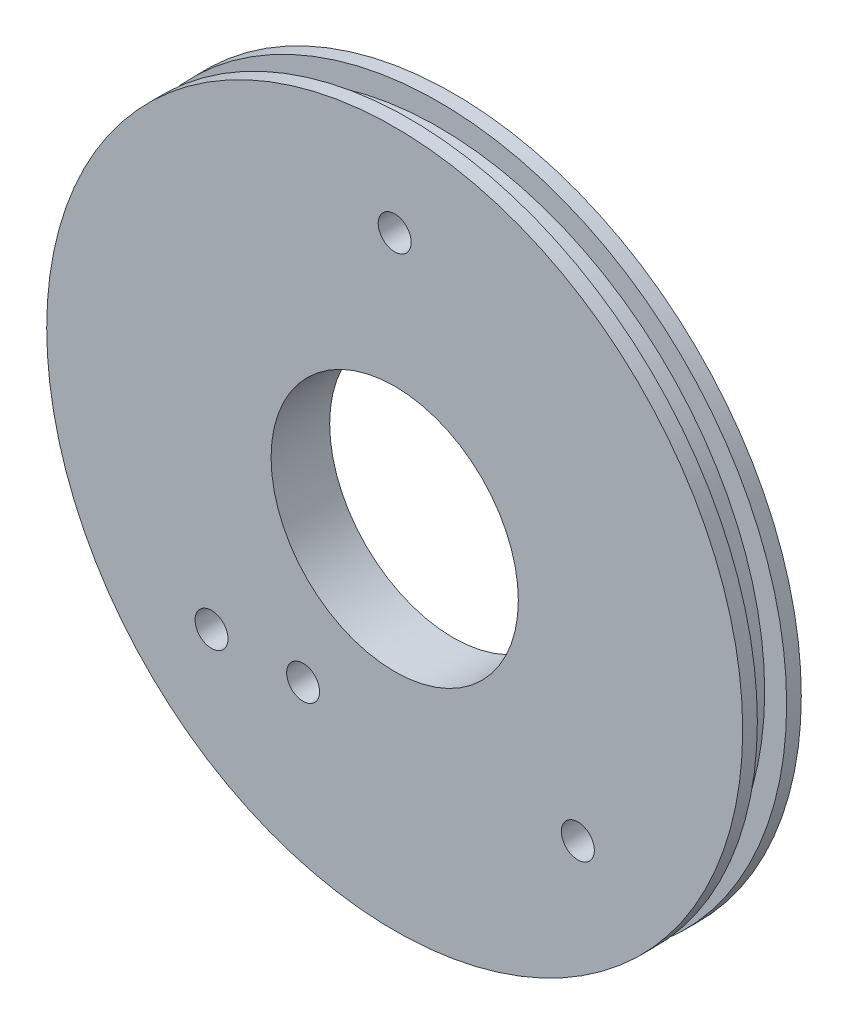
ISO-10303-21;
HEADER;
FILE_DESCRIPTION(('STEP AP214'),'2;1');
FILE_NAME('part.step','',(''),(''),'','','');
FILE_SCHEMA(('AUTOMOTIVE_DESIGN { 1 0 10303 214 1 1 1 1 }'));
ENDSEC;
DATA;
#1=APPLICATION_CONTEXT('core data for automotive mechanical design processes');
#2=APPLICATION_PROTOCOL_DEFINITION('international standard','automotive_design',2000,#1);
#3=PRODUCT_CONTEXT('',#1,'mechanical');
#4=PRODUCT('Part','Part','',(#3));
#5=PRODUCT_RELATED_PRODUCT_CATEGORY('part','',(#4));
#6=PRODUCT_DEFINITION_FORMATION('','',#4);
#7=PRODUCT_DEFINITION_CONTEXT('part definition',#1,'design');
#8=PRODUCT_DEFINITION('design','',#6,#7);
#9=PRODUCT_DEFINITION_SHAPE('','',#8);
#10=(LENGTH_UNIT() NAMED_UNIT(*) SI_UNIT(.MILLI.,.METRE.));
#11=(NAMED_UNIT(*) PLANE_ANGLE_UNIT() SI_UNIT($,.RADIAN.));
#12=(NAMED_UNIT(*) SI_UNIT($,.STERADIAN.) SOLID_ANGLE_UNIT());
#13=UNCERTAINTY_MEASURE_WITH_UNIT(LENGTH_MEASURE(1.E-05),#10,'distance_accuracy_value','');
#14=(GEOMETRIC_REPRESENTATION_CONTEXT(3) GLOBAL_UNCERTAINTY_ASSIGNED_CONTEXT((#13)) GLOBAL_UNIT_ASSIGNED_CONTEXT((#10,
#11,#12)) REPRESENTATION_CONTEXT('',''));
#15=CARTESIAN_POINT('',(0.,0.,0.));
#16=DIRECTION('',(0.,0.,1.));
#17=DIRECTION('',(1.,0.,0.));
#18=AXIS2_PLACEMENT_3D('',#15,#16,#17);
#19=CARTESIAN_POINT('',(0.,0.,8.));
#20=DIRECTION('',(0.,0.,1.));
#21=DIRECTION('',(1.,0.,0.));
#22=AXIS2_PLACEMENT_3D('',#19,#20,#21);
#23=PLANE('',#22);
#24=CARTESIAN_POINT('',(0.,70.,8.00000000000001));
#25=DIRECTION('',(0.,0.,1.));
#26=DIRECTION('',(1.,0.,0.));
#27=AXIS2_PLACEMENT_3D('',#24,#25,#26);
#28=CIRCLE('',#27,4.5);
#29=CARTESIAN_POINT('',(4.5,70.,8.00000000000001));
#30=VERTEX_POINT('',#29);
#31=EDGE_CURVE('E102',#30,#30,#28,.F.);
#32=ORIENTED_EDGE('',*,*,#31,.T.);
#33=EDGE_LOOP('',(#32));
#34=FACE_BOUND('',#33,.T.);
#35=CARTESIAN_POINT('',(0.,0.,8.));
#36=DIRECTION('',(0.,0.,1.));
#37=DIRECTION('',(1.,0.,0.));
#38=AXIS2_PLACEMENT_3D('',#35,#36,#37);
#39=CIRCLE('',#38,33.75);
#40=CARTESIAN_POINT('',(33.75,0.,8.));
#41=VERTEX_POINT('',#40);
#42=EDGE_CURVE('E93',#41,#41,#39,.T.);
#43=ORIENTED_EDGE('',*,*,#42,.F.);
#44=EDGE_LOOP('',(#43));
#45=FACE_BOUND('',#44,.T.);
#46=CARTESIAN_POINT('',(-50.,-48.75,8.));
#47=DIRECTION('',(0.,0.,1.));
#48=DIRECTION('',(1.,0.,0.));
#49=AXIS2_PLACEMENT_3D('',#46,#47,#48);
#50=CIRCLE('',#49,4.5);
#51=CARTESIAN_POINT('',(-45.5,-48.75,8.00000000000001));
#52=VERTEX_POINT('',#51);
#53=EDGE_CURVE('E81',#52,#52,#50,.T.);
#54=ORIENTED_EDGE('',*,*,#53,.F.);
#55=EDGE_LOOP('',(#54));
#56=FACE_BOUND('',#55,.T.);
#57=CARTESIAN_POINT('',(50.,-48.75,8.));
#58=DIRECTION('',(0.,0.,1.));
#59=DIRECTION('',(1.,0.,0.));
#60=AXIS2_PLACEMENT_3D('',#57,#58,#59);
#61=CIRCLE('',#60,4.5);
#62=CARTESIAN_POINT('',(54.5,-48.75,8.00000000000001));
#63=VERTEX_POINT('',#62);
#64=EDGE_CURVE('E99',#63,#63,#61,.T.);
#65=ORIENTED_EDGE('',*,*,#64,.F.);
#66=EDGE_LOOP('',(#65));
#67=FACE_BOUND('',#66,.T.);
#68=CARTESIAN_POINT('',(-25.,-48.75,8.));
#69=DIRECTION('',(0.,0.,1.));
#70=DIRECTION('',(1.,0.,0.));
#71=AXIS2_PLACEMENT_3D('',#68,#69,#70);
#72=CIRCLE('',#71,4.50000000000001);
#73=CARTESIAN_POINT('',(-20.5,-48.75,8.00000000000001));
#74=VERTEX_POINT('',#73);
#75=EDGE_CURVE('E92',#74,#74,#72,.T.);
#76=ORIENTED_EDGE('',*,*,#75,.F.);
#77=EDGE_LOOP('',(#76));
#78=FACE_BOUND('',#77,.T.);
#79=CARTESIAN_POINT('',(0.,0.,8.));
#80=DIRECTION('',(0.,0.,1.));
#81=DIRECTION('',(1.,0.,0.));
#82=AXIS2_PLACEMENT_3D('',#79,#80,#81);
#83=CIRCLE('',#82,95.);
#84=CARTESIAN_POINT('',(95.,0.,8.));
#85=VERTEX_POINT('',#84);
#86=EDGE_CURVE('E66',#85,#85,#83,.T.);
#87=ORIENTED_EDGE('',*,*,#86,.T.);
#88=EDGE_LOOP('',(#87));
#89=FACE_BOUND('',#88,.T.);
#90=ADVANCED_FACE('F57',(#34,#45,#56,#67,#78,#89),#23,.T.);
#91=CARTESIAN_POINT('',(0.,0.,-8.));
#92=DIRECTION('',(0.,0.,1.));
#93=DIRECTION('',(1.,0.,0.));
#94=AXIS2_PLACEMENT_3D('',#91,#92,#93);
#95=CYLINDRICAL_SURFACE('',#94,95.);
#96=CARTESIAN_POINT('',(0.,0.,4.));
#97=DIRECTION('',(0.,0.,1.));
#98=DIRECTION('',(1.,0.,0.));
#99=AXIS2_PLACEMENT_3D('',#96,#97,#98);
#100=CIRCLE('',#99,95.);
#101=CARTESIAN_POINT('',(95.,0.,4.));
#102=VERTEX_POINT('',#101);
#103=EDGE_CURVE('E72',#102,#102,#100,.T.);
#104=ORIENTED_EDGE('',*,*,#103,.T.);
#105=EDGE_LOOP('',(#104));
#106=FACE_BOUND('',#105,.T.);
#107=ORIENTED_EDGE('',*,*,#86,.F.);
#108=EDGE_LOOP('',(#107));
#109=FACE_BOUND('',#108,.T.);
#110=ADVANCED_FACE('F59',(#106,#109),#95,.T.);
#111=CARTESIAN_POINT('',(0.,0.,4.));
#112=DIRECTION('',(0.,0.,1.));
#113=DIRECTION('',(1.,0.,0.));
#114=AXIS2_PLACEMENT_3D('',#111,#112,#113);
#115=PLANE('',#114);
#116=ORIENTED_EDGE('',*,*,#103,.F.);
#117=EDGE_LOOP('',(#116));
#118=FACE_BOUND('',#117,.T.);
#119=CARTESIAN_POINT('',(0.,0.,4.));
#120=DIRECTION('',(0.,0.,1.));
#121=DIRECTION('',(1.,0.,0.));
#122=AXIS2_PLACEMENT_3D('',#119,#120,#121);
#123=CIRCLE('',#122,89.);
#124=CARTESIAN_POINT('',(89.,0.,4.));
#125=VERTEX_POINT('',#124);
#126=EDGE_CURVE('E123',#125,#125,#123,.T.);
#127=ORIENTED_EDGE('',*,*,#126,.T.);
#128=EDGE_LOOP('',(#127));
#129=FACE_BOUND('',#128,.T.);
#130=ADVANCED_FACE('F132',(#118,#129),#115,.F.);
#131=CARTESIAN_POINT('',(0.,0.,4.));
#132=DIRECTION('',(0.,0.,-1.));
#133=DIRECTION('',(-1.,0.,0.));
#134=AXIS2_PLACEMENT_3D('',#131,#132,#133);
#135=CYLINDRICAL_SURFACE('',#134,89.);
#136=ORIENTED_EDGE('',*,*,#126,.F.);
#137=EDGE_LOOP('',(#136));
#138=FACE_BOUND('',#137,.T.);
#139=CARTESIAN_POINT('',(0.,0.,-4.));
#140=DIRECTION('',(0.,0.,1.));
#141=DIRECTION('',(1.,0.,0.));
#142=AXIS2_PLACEMENT_3D('',#139,#140,#141);
#143=CIRCLE('',#142,89.);
#144=CARTESIAN_POINT('',(89.,0.,-4.));
#145=VERTEX_POINT('',#144);
#146=EDGE_CURVE('E88',#145,#145,#143,.T.);
#147=ORIENTED_EDGE('',*,*,#146,.T.);
#148=EDGE_LOOP('',(#147));
#149=FACE_BOUND('',#148,.T.);
#150=ADVANCED_FACE('F135',(#138,#149),#135,.T.);
#151=CARTESIAN_POINT('',(0.,0.,-4.));
#152=DIRECTION('',(0.,0.,1.));
#153=DIRECTION('',(1.,0.,0.));
#154=AXIS2_PLACEMENT_3D('',#151,#152,#153);
#155=PLANE('',#154);
#156=ORIENTED_EDGE('',*,*,#146,.F.);
#157=EDGE_LOOP('',(#156));
#158=FACE_BOUND('',#157,.T.);
#159=CARTESIAN_POINT('',(0.,0.,-4.));
#160=DIRECTION('',(0.,0.,1.));
#161=DIRECTION('',(1.,0.,0.));
#162=AXIS2_PLACEMENT_3D('',#159,#160,#161);
#163=CIRCLE('',#162,95.);
#164=CARTESIAN_POINT('',(95.,0.,-4.));
#165=VERTEX_POINT('',#164);
#166=EDGE_CURVE('E119',#165,#165,#163,.T.);
#167=ORIENTED_EDGE('',*,*,#166,.T.);
#168=EDGE_LOOP('',(#167));
#169=FACE_BOUND('',#168,.T.);
#170=ADVANCED_FACE('F141',(#158,#169),#155,.T.);
#171=CARTESIAN_POINT('',(0.,0.,-8.));
#172=DIRECTION('',(0.,0.,1.));
#173=DIRECTION('',(1.,0.,0.));
#174=AXIS2_PLACEMENT_3D('',#171,#172,#173);
#175=PLANE('',#174);
#176=CARTESIAN_POINT('',(0.,70.,-8.00000000000001));
#177=DIRECTION('',(0.,0.,1.));
#178=DIRECTION('',(1.,0.,0.));
#179=AXIS2_PLACEMENT_3D('',#176,#177,#178);
#180=CIRCLE('',#179,4.5);
#181=CARTESIAN_POINT('',(4.5,70.,-8.00000000000001));
#182=VERTEX_POINT('',#181);
#183=EDGE_CURVE('E61',#182,#182,#180,.F.);
#184=ORIENTED_EDGE('',*,*,#183,.F.);
#185=EDGE_LOOP('',(#184));
#186=FACE_BOUND('',#185,.T.);
#187=CARTESIAN_POINT('',(0.,0.,-8.));
#188=DIRECTION('',(0.,0.,1.));
#189=DIRECTION('',(1.,0.,0.));
#190=AXIS2_PLACEMENT_3D('',#187,#188,#189);
#191=CIRCLE('',#190,33.75);
#192=CARTESIAN_POINT('',(33.75,0.,-8.));
#193=VERTEX_POINT('',#192);
#194=EDGE_CURVE('E89',#193,#193,#191,.T.);
#195=ORIENTED_EDGE('',*,*,#194,.T.);
#196=EDGE_LOOP('',(#195));
#197=FACE_BOUND('',#196,.T.);
#198=CARTESIAN_POINT('',(-50.,-48.75,-8.00000000000001));
#199=DIRECTION('',(0.,0.,1.));
#200=DIRECTION('',(1.,0.,0.));
#201=AXIS2_PLACEMENT_3D('',#198,#199,#200);
#202=CIRCLE('',#201,4.5);
#203=CARTESIAN_POINT('',(-45.5,-48.75,-8.00000000000001));
#204=VERTEX_POINT('',#203);
#205=EDGE_CURVE('E85',#204,#204,#202,.T.);
#206=ORIENTED_EDGE('',*,*,#205,.T.);
#207=EDGE_LOOP('',(#206));
#208=FACE_BOUND('',#207,.T.);
#209=CARTESIAN_POINT('',(50.,-48.75,-8.00000000000001));
#210=DIRECTION('',(0.,0.,1.));
#211=DIRECTION('',(1.,0.,0.));
#212=AXIS2_PLACEMENT_3D('',#209,#210,#211);
#213=CIRCLE('',#212,4.5);
#214=CARTESIAN_POINT('',(54.5,-48.75,-8.00000000000001));
#215=VERTEX_POINT('',#214);
#216=EDGE_CURVE('E80',#215,#215,#213,.T.);
#217=ORIENTED_EDGE('',*,*,#216,.T.);
#218=EDGE_LOOP('',(#217));
#219=FACE_BOUND('',#218,.T.);
#220=CARTESIAN_POINT('',(-25.,-48.75,-8.00000000000001));
#221=DIRECTION('',(0.,0.,1.));
#222=DIRECTION('',(1.,0.,0.));
#223=AXIS2_PLACEMENT_3D('',#220,#221,#222);
#224=CIRCLE('',#223,4.50000000000001);
#225=CARTESIAN_POINT('',(-20.5,-48.75,-8.00000000000001));
#226=VERTEX_POINT('',#225);
#227=EDGE_CURVE('E76',#226,#226,#224,.T.);
#228=ORIENTED_EDGE('',*,*,#227,.T.);
#229=EDGE_LOOP('',(#228));
#230=FACE_BOUND('',#229,.T.);
#231=CARTESIAN_POINT('',(0.,0.,-8.));
#232=DIRECTION('',(0.,0.,1.));
#233=DIRECTION('',(1.,0.,0.));
#234=AXIS2_PLACEMENT_3D('',#231,#232,#233);
#235=CIRCLE('',#234,95.);
#236=CARTESIAN_POINT('',(95.,0.,-8.));
#237=VERTEX_POINT('',#236);
#238=EDGE_CURVE('E11',#237,#237,#235,.T.);
#239=ORIENTED_EDGE('',*,*,#238,.F.);
#240=EDGE_LOOP('',(#239));
#241=FACE_BOUND('',#240,.T.);
#242=ADVANCED_FACE('F147',(#186,#197,#208,#219,#230,#241),#175,.F.);
#243=ORIENTED_EDGE('',*,*,#238,.T.);
#244=EDGE_LOOP('',(#243));
#245=FACE_BOUND('',#244,.T.);
#246=ORIENTED_EDGE('',*,*,#166,.F.);
#247=EDGE_LOOP('',(#246));
#248=FACE_BOUND('',#247,.T.);
#249=ADVANCED_FACE('F151',(#245,#248),#95,.T.);
#250=CARTESIAN_POINT('',(-25.,-48.75,-159.));
#251=DIRECTION('',(0.,0.,1.));
#252=DIRECTION('',(1.,0.,0.));
#253=AXIS2_PLACEMENT_3D('',#250,#251,#252);
#254=CYLINDRICAL_SURFACE('',#253,4.50000000000001);
#255=CARTESIAN_POINT('',(-20.5,-48.75,8.00000000000001));
#256=CARTESIAN_POINT('',(-20.5,-48.75,7.83333333333334));
#257=CARTESIAN_POINT('',(-20.5,-48.75,7.66666666666667));
#258=CARTESIAN_POINT('',(-20.5,-48.75,7.33333333333334));
#259=CARTESIAN_POINT('',(-20.5,-48.75,7.16666666666667));
#260=CARTESIAN_POINT('',(-20.5,-48.75,6.83333333333334));
#261=CARTESIAN_POINT('',(-20.5,-48.75,6.66666666666667));
#262=CARTESIAN_POINT('',(-20.5,-48.75,6.33333333333334));
#263=CARTESIAN_POINT('',(-20.5,-48.75,6.16666666666667));
#264=CARTESIAN_POINT('',(-20.5,-48.75,5.83333333333334));
#265=CARTESIAN_POINT('',(-20.5,-48.75,5.66666666666667));
#266=CARTESIAN_POINT('',(-20.5,-48.75,5.33333333333334));
#267=CARTESIAN_POINT('',(-20.5,-48.75,5.16666666666667));
#268=CARTESIAN_POINT('',(-20.5,-48.75,4.83333333333334));
#269=CARTESIAN_POINT('',(-20.5,-48.75,4.66666666666667));
#270=CARTESIAN_POINT('',(-20.5,-48.75,4.33333333333334));
#271=CARTESIAN_POINT('',(-20.5,-48.75,4.16666666666667));
#272=CARTESIAN_POINT('',(-20.5,-48.75,3.83333333333334));
#273=CARTESIAN_POINT('',(-20.5,-48.75,3.66666666666667));
#274=CARTESIAN_POINT('',(-20.5,-48.75,3.33333333333334));
#275=CARTESIAN_POINT('',(-20.5,-48.75,3.16666666666667));
#276=CARTESIAN_POINT('',(-20.5,-48.75,2.83333333333334));
#277=CARTESIAN_POINT('',(-20.5,-48.75,2.66666666666667));
#278=CARTESIAN_POINT('',(-20.5,-48.75,2.33333333333334));
#279=CARTESIAN_POINT('',(-20.5,-48.75,2.16666666666667));
#280=CARTESIAN_POINT('',(-20.5,-48.75,1.83333333333334));
#281=CARTESIAN_POINT('',(-20.5,-48.75,1.66666666666667));
#282=CARTESIAN_POINT('',(-20.5,-48.75,1.33333333333333));
#283=CARTESIAN_POINT('',(-20.5,-48.75,1.16666666666667));
#284=CARTESIAN_POINT('',(-20.5,-48.75,0.833333333333334));
#285=CARTESIAN_POINT('',(-20.5,-48.75,0.666666666666667));
#286=CARTESIAN_POINT('',(-20.5,-48.75,0.333333333333334));
#287=CARTESIAN_POINT('',(-20.5,-48.75,0.166666666666667));
#288=CARTESIAN_POINT('',(-20.5,-48.75,-0.166666666666667));
#289=CARTESIAN_POINT('',(-20.5,-48.75,-0.333333333333334));
#290=CARTESIAN_POINT('',(-20.5,-48.75,-0.666666666666667));
#291=CARTESIAN_POINT('',(-20.5,-48.75,-0.833333333333334));
#292=CARTESIAN_POINT('',(-20.5,-48.75,-1.16666666666667));
#293=CARTESIAN_POINT('',(-20.5,-48.75,-1.33333333333333));
#294=CARTESIAN_POINT('',(-20.5,-48.75,-1.66666666666667));
#295=CARTESIAN_POINT('',(-20.5,-48.75,-1.83333333333334));
#296=CARTESIAN_POINT('',(-20.5,-48.75,-2.16666666666667));
#297=CARTESIAN_POINT('',(-20.5,-48.75,-2.33333333333334));
#298=CARTESIAN_POINT('',(-20.5,-48.75,-2.66666666666667));
#299=CARTESIAN_POINT('',(-20.5,-48.75,-2.83333333333334));
#300=CARTESIAN_POINT('',(-20.5,-48.75,-3.16666666666667));
#301=CARTESIAN_POINT('',(-20.5,-48.75,-3.33333333333334));
#302=CARTESIAN_POINT('',(-20.5,-48.75,-3.66666666666667));
#303=CARTESIAN_POINT('',(-20.5,-48.75,-3.83333333333334));
#304=CARTESIAN_POINT('',(-20.5,-48.75,-4.16666666666667));
#305=CARTESIAN_POINT('',(-20.5,-48.75,-4.33333333333334));
#306=CARTESIAN_POINT('',(-20.5,-48.75,-4.66666666666667));
#307=CARTESIAN_POINT('',(-20.5,-48.75,-4.83333333333334));
#308=CARTESIAN_POINT('',(-20.5,-48.75,-5.16666666666667));
#309=CARTESIAN_POINT('',(-20.5,-48.75,-5.33333333333334));
#310=CARTESIAN_POINT('',(-20.5,-48.75,-5.66666666666667));
#311=CARTESIAN_POINT('',(-20.5,-48.75,-5.83333333333334));
#312=CARTESIAN_POINT('',(-20.5,-48.75,-6.16666666666667));
#313=CARTESIAN_POINT('',(-20.5,-48.75,-6.33333333333334));
#314=CARTESIAN_POINT('',(-20.5,-48.75,-6.66666666666667));
#315=CARTESIAN_POINT('',(-20.5,-48.75,-6.83333333333334));
#316=CARTESIAN_POINT('',(-20.5,-48.75,-7.16666666666667));
#317=CARTESIAN_POINT('',(-20.5,-48.75,-7.33333333333334));
#318=CARTESIAN_POINT('',(-20.5,-48.75,-7.66666666666667));
#319=CARTESIAN_POINT('',(-20.5,-48.75,-7.83333333333334));
#320=CARTESIAN_POINT('',(-20.5,-48.75,-8.00000000000001));
#321=B_SPLINE_CURVE_WITH_KNOTS('',3,(#255,#256,#257,#258,#259,#260,#261,#262,#263,#264,#265,
#266,#267,#268,#269,#270,#271,#272,#273,#274,#275,#276,#277,#278,#279,#280,#281,#282,#283,#284,
#285,#286,#287,#288,#289,#290,#291,#292,#293,#294,#295,#296,#297,#298,#299,#300,#301,#302,#303,
#304,#305,#306,#307,#308,#309,#310,#311,#312,#313,#314,#315,#316,#317,#318,#319,#320),
.UNSPECIFIED.,.F.,.F.,(4,2,2,2,2,2,2,2,2,2,2,2,2,2,2,2,2,2,2,2,2,2,2,2,2,2,2,2,2,2,2,2,4),(0.,
0.5,1.,1.5,2.,2.5,3.,3.5,4.,4.5,5.,5.50000000000001,6.00000000000001,6.50000000000001,
7.00000000000001,7.50000000000001,8.00000000000001,8.50000000000001,9.00000000000001,
9.50000000000001,10.,10.5,11.,11.5,12.,12.5,13.,13.5,14.,14.5,15.,15.5,16.),.UNSPECIFIED.);
#322=EDGE_CURVE('BSEAM153',#74,#226,#321,.T.);
#323=ORIENTED_EDGE('',*,*,#75,.T.);
#324=ORIENTED_EDGE('',*,*,#227,.F.);
#325=ORIENTED_EDGE('',*,*,#322,.T.);
#326=ORIENTED_EDGE('',*,*,#322,.F.);
#327=EDGE_LOOP('',(#323,#325,#324,#326));
#328=FACE_BOUND('',#327,.T.);
#329=ADVANCED_FACE('F153',(#328),#254,.F.);
#330=CARTESIAN_POINT('',(50.,-48.75,-159.));
#331=DIRECTION('',(0.,0.,1.));
#332=DIRECTION('',(1.,0.,0.));
#333=AXIS2_PLACEMENT_3D('',#330,#331,#332);
#334=CYLINDRICAL_SURFACE('',#333,4.5);
#335=CARTESIAN_POINT('',(54.5,-48.75,8.00000000000001));
#336=CARTESIAN_POINT('',(54.5,-48.75,7.83333333333334));
#337=CARTESIAN_POINT('',(54.5,-48.75,7.66666666666667));
#338=CARTESIAN_POINT('',(54.5,-48.75,7.33333333333334));
#339=CARTESIAN_POINT('',(54.5,-48.75,7.16666666666667));
#340=CARTESIAN_POINT('',(54.5,-48.75,6.83333333333334));
#341=CARTESIAN_POINT('',(54.5,-48.75,6.66666666666667));
#342=CARTESIAN_POINT('',(54.5,-48.75,6.33333333333334));
#343=CARTESIAN_POINT('',(54.5,-48.75,6.16666666666667));
#344=CARTESIAN_POINT('',(54.5,-48.75,5.83333333333334));
#345=CARTESIAN_POINT('',(54.5,-48.75,5.66666666666667));
#346=CARTESIAN_POINT('',(54.5,-48.75,5.33333333333334));
#347=CARTESIAN_POINT('',(54.5,-48.75,5.16666666666667));
#348=CARTESIAN_POINT('',(54.5,-48.75,4.83333333333334));
#349=CARTESIAN_POINT('',(54.5,-48.75,4.66666666666667));
#350=CARTESIAN_POINT('',(54.5,-48.75,4.33333333333334));
#351=CARTESIAN_POINT('',(54.5,-48.75,4.16666666666667));
#352=CARTESIAN_POINT('',(54.5,-48.75,3.83333333333334));
#353=CARTESIAN_POINT('',(54.5,-48.75,3.66666666666667));
#354=CARTESIAN_POINT('',(54.5,-48.75,3.33333333333334));
#355=CARTESIAN_POINT('',(54.5,-48.75,3.16666666666667));
#356=CARTESIAN_POINT('',(54.5,-48.75,2.83333333333334));
#357=CARTESIAN_POINT('',(54.5,-48.75,2.66666666666667));
#358=CARTESIAN_POINT('',(54.5,-48.75,2.33333333333334));
#359=CARTESIAN_POINT('',(54.5,-48.75,2.16666666666667));
#360=CARTESIAN_POINT('',(54.5,-48.75,1.83333333333334));
#361=CARTESIAN_POINT('',(54.5,-48.75,1.66666666666667));
#362=CARTESIAN_POINT('',(54.5,-48.75,1.33333333333333));
#363=CARTESIAN_POINT('',(54.5,-48.75,1.16666666666667));
#364=CARTESIAN_POINT('',(54.5,-48.75,0.833333333333334));
#365=CARTESIAN_POINT('',(54.5,-48.75,0.666666666666667));
#366=CARTESIAN_POINT('',(54.5,-48.75,0.333333333333334));
#367=CARTESIAN_POINT('',(54.5,-48.75,0.166666666666667));
#368=CARTESIAN_POINT('',(54.5,-48.75,-0.166666666666667));
#369=CARTESIAN_POINT('',(54.5,-48.75,-0.333333333333334));
#370=CARTESIAN_POINT('',(54.5,-48.75,-0.666666666666667));
#371=CARTESIAN_POINT('',(54.5,-48.75,-0.833333333333334));
#372=CARTESIAN_POINT('',(54.5,-48.75,-1.16666666666667));
#373=CARTESIAN_POINT('',(54.5,-48.75,-1.33333333333333));
#374=CARTESIAN_POINT('',(54.5,-48.75,-1.66666666666667));
#375=CARTESIAN_POINT('',(54.5,-48.75,-1.83333333333334));
#376=CARTESIAN_POINT('',(54.5,-48.75,-2.16666666666667));
#377=CARTESIAN_POINT('',(54.5,-48.75,-2.33333333333334));
#378=CARTESIAN_POINT('',(54.5,-48.75,-2.66666666666667));
#379=CARTESIAN_POINT('',(54.5,-48.75,-2.83333333333334));
#380=CARTESIAN_POINT('',(54.5,-48.75,-3.16666666666667));
#381=CARTESIAN_POINT('',(54.5,-48.75,-3.33333333333334));
#382=CARTESIAN_POINT('',(54.5,-48.75,-3.66666666666667));
#383=CARTESIAN_POINT('',(54.5,-48.75,-3.83333333333334));
#384=CARTESIAN_POINT('',(54.5,-48.75,-4.16666666666667));
#385=CARTESIAN_POINT('',(54.5,-48.75,-4.33333333333334));
#386=CARTESIAN_POINT('',(54.5,-48.75,-4.66666666666667));
#387=CARTESIAN_POINT('',(54.5,-48.75,-4.83333333333334));
#388=CARTESIAN_POINT('',(54.5,-48.75,-5.16666666666667));
#389=CARTESIAN_POINT('',(54.5,-48.75,-5.33333333333334));
#390=CARTESIAN_POINT('',(54.5,-48.75,-5.66666666666667));
#391=CARTESIAN_POINT('',(54.5,-48.75,-5.83333333333334));
#392=CARTESIAN_POINT('',(54.5,-48.75,-6.16666666666667));
#393=CARTESIAN_POINT('',(54.5,-48.75,-6.33333333333334));
#394=CARTESIAN_POINT('',(54.5,-48.75,-6.66666666666667));
#395=CARTESIAN_POINT('',(54.5,-48.75,-6.83333333333334));
#396=CARTESIAN_POINT('',(54.5,-48.75,-7.16666666666667));
#397=CARTESIAN_POINT('',(54.5,-48.75,-7.33333333333334));
#398=CARTESIAN_POINT('',(54.5,-48.75,-7.66666666666667));
#399=CARTESIAN_POINT('',(54.5,-48.75,-7.83333333333334));
#400=CARTESIAN_POINT('',(54.5,-48.75,-8.00000000000001));
#401=B_SPLINE_CURVE_WITH_KNOTS('',3,(#335,#336,#337,#338,#339,#340,#341,#342,#343,#344,#345,
#346,#347,#348,#349,#350,#351,#352,#353,#354,#355,#356,#357,#358,#359,#360,#361,#362,#363,#364,
#365,#366,#367,#368,#369,#370,#371,#372,#373,#374,#375,#376,#377,#378,#379,#380,#381,#382,#383,
#384,#385,#386,#387,#388,#389,#390,#391,#392,#393,#394,#395,#396,#397,#398,#399,#400),
.UNSPECIFIED.,.F.,.F.,(4,2,2,2,2,2,2,2,2,2,2,2,2,2,2,2,2,2,2,2,2,2,2,2,2,2,2,2,2,2,2,2,4),(0.,
0.5,1.,1.5,2.,2.5,3.,3.5,4.,4.5,5.,5.50000000000001,6.00000000000001,6.50000000000001,
7.00000000000001,7.50000000000001,8.00000000000001,8.50000000000001,9.00000000000001,
9.50000000000001,10.,10.5,11.,11.5,12.,12.5,13.,13.5,14.,14.5,15.,15.5,16.),.UNSPECIFIED.);
#402=EDGE_CURVE('BSEAM158',#63,#215,#401,.T.);
#403=ORIENTED_EDGE('',*,*,#64,.T.);
#404=ORIENTED_EDGE('',*,*,#216,.F.);
#405=ORIENTED_EDGE('',*,*,#402,.T.);
#406=ORIENTED_EDGE('',*,*,#402,.F.);
#407=EDGE_LOOP('',(#403,#405,#404,#406));
#408=FACE_BOUND('',#407,.T.);
#409=ADVANCED_FACE('F158',(#408),#334,.F.);
#410=CARTESIAN_POINT('',(-50.,-48.75,-159.));
#411=DIRECTION('',(0.,0.,1.));
#412=DIRECTION('',(1.,0.,0.));
#413=AXIS2_PLACEMENT_3D('',#410,#411,#412);
#414=CYLINDRICAL_SURFACE('',#413,4.5);
#415=CARTESIAN_POINT('',(-45.5,-48.75,8.00000000000001));
#416=CARTESIAN_POINT('',(-45.5,-48.75,7.83333333333334));
#417=CARTESIAN_POINT('',(-45.5,-48.75,7.66666666666667));
#418=CARTESIAN_POINT('',(-45.5,-48.75,7.33333333333334));
#419=CARTESIAN_POINT('',(-45.5,-48.75,7.16666666666667));
#420=CARTESIAN_POINT('',(-45.5,-48.75,6.83333333333334));
#421=CARTESIAN_POINT('',(-45.5,-48.75,6.66666666666667));
#422=CARTESIAN_POINT('',(-45.5,-48.75,6.33333333333334));
#423=CARTESIAN_POINT('',(-45.5,-48.75,6.16666666666667));
#424=CARTESIAN_POINT('',(-45.5,-48.75,5.83333333333334));
#425=CARTESIAN_POINT('',(-45.5,-48.75,5.66666666666667));
#426=CARTESIAN_POINT('',(-45.5,-48.75,5.33333333333334));
#427=CARTESIAN_POINT('',(-45.5,-48.75,5.16666666666667));
#428=CARTESIAN_POINT('',(-45.5,-48.75,4.83333333333334));
#429=CARTESIAN_POINT('',(-45.5,-48.75,4.66666666666667));
#430=CARTESIAN_POINT('',(-45.5,-48.75,4.33333333333334));
#431=CARTESIAN_POINT('',(-45.5,-48.75,4.16666666666667));
#432=CARTESIAN_POINT('',(-45.5,-48.75,3.83333333333334));
#433=CARTESIAN_POINT('',(-45.5,-48.75,3.66666666666667));
#434=CARTESIAN_POINT('',(-45.5,-48.75,3.33333333333334));
#435=CARTESIAN_POINT('',(-45.5,-48.75,3.16666666666667));
#436=CARTESIAN_POINT('',(-45.5,-48.75,2.83333333333334));
#437=CARTESIAN_POINT('',(-45.5,-48.75,2.66666666666667));
#438=CARTESIAN_POINT('',(-45.5,-48.75,2.33333333333334));
#439=CARTESIAN_POINT('',(-45.5,-48.75,2.16666666666667));
#440=CARTESIAN_POINT('',(-45.5,-48.75,1.83333333333334));
#441=CARTESIAN_POINT('',(-45.5,-48.75,1.66666666666667));
#442=CARTESIAN_POINT('',(-45.5,-48.75,1.33333333333333));
#443=CARTESIAN_POINT('',(-45.5,-48.75,1.16666666666667));
#444=CARTESIAN_POINT('',(-45.5,-48.75,0.833333333333334));
#445=CARTESIAN_POINT('',(-45.5,-48.75,0.666666666666667));
#446=CARTESIAN_POINT('',(-45.5,-48.75,0.333333333333334));
#447=CARTESIAN_POINT('',(-45.5,-48.75,0.166666666666667));
#448=CARTESIAN_POINT('',(-45.5,-48.75,-0.166666666666667));
#449=CARTESIAN_POINT('',(-45.5,-48.75,-0.333333333333334));
#450=CARTESIAN_POINT('',(-45.5,-48.75,-0.666666666666667));
#451=CARTESIAN_POINT('',(-45.5,-48.75,-0.833333333333334));
#452=CARTESIAN_POINT('',(-45.5,-48.75,-1.16666666666667));
#453=CARTESIAN_POINT('',(-45.5,-48.75,-1.33333333333333));
#454=CARTESIAN_POINT('',(-45.5,-48.75,-1.66666666666667));
#455=CARTESIAN_POINT('',(-45.5,-48.75,-1.83333333333334));
#456=CARTESIAN_POINT('',(-45.5,-48.75,-2.16666666666667));
#457=CARTESIAN_POINT('',(-45.5,-48.75,-2.33333333333334));
#458=CARTESIAN_POINT('',(-45.5,-48.75,-2.66666666666667));
#459=CARTESIAN_POINT('',(-45.5,-48.75,-2.83333333333334));
#460=CARTESIAN_POINT('',(-45.5,-48.75,-3.16666666666667));
#461=CARTESIAN_POINT('',(-45.5,-48.75,-3.33333333333334));
#462=CARTESIAN_POINT('',(-45.5,-48.75,-3.66666666666667));
#463=CARTESIAN_POINT('',(-45.5,-48.75,-3.83333333333334));
#464=CARTESIAN_POINT('',(-45.5,-48.75,-4.16666666666667));
#465=CARTESIAN_POINT('',(-45.5,-48.75,-4.33333333333334));
#466=CARTESIAN_POINT('',(-45.5,-48.75,-4.66666666666667));
#467=CARTESIAN_POINT('',(-45.5,-48.75,-4.83333333333334));
#468=CARTESIAN_POINT('',(-45.5,-48.75,-5.16666666666667));
#469=CARTESIAN_POINT('',(-45.5,-48.75,-5.33333333333334));
#470=CARTESIAN_POINT('',(-45.5,-48.75,-5.66666666666667));
#471=CARTESIAN_POINT('',(-45.5,-48.75,-5.83333333333334));
#472=CARTESIAN_POINT('',(-45.5,-48.75,-6.16666666666667));
#473=CARTESIAN_POINT('',(-45.5,-48.75,-6.33333333333334));
#474=CARTESIAN_POINT('',(-45.5,-48.75,-6.66666666666667));
#475=CARTESIAN_POINT('',(-45.5,-48.75,-6.83333333333334));
#476=CARTESIAN_POINT('',(-45.5,-48.75,-7.16666666666667));
#477=CARTESIAN_POINT('',(-45.5,-48.75,-7.33333333333334));
#478=CARTESIAN_POINT('',(-45.5,-48.75,-7.66666666666667));
#479=CARTESIAN_POINT('',(-45.5,-48.75,-7.83333333333334));
#480=CARTESIAN_POINT('',(-45.5,-48.75,-8.00000000000001));
#481=B_SPLINE_CURVE_WITH_KNOTS('',3,(#415,#416,#417,#418,#419,#420,#421,#422,#423,#424,#425,
#426,#427,#428,#429,#430,#431,#432,#433,#434,#435,#436,#437,#438,#439,#440,#441,#442,#443,#444,
#445,#446,#447,#448,#449,#450,#451,#452,#453,#454,#455,#456,#457,#458,#459,#460,#461,#462,#463,
#464,#465,#466,#467,#468,#469,#470,#471,#472,#473,#474,#475,#476,#477,#478,#479,#480),
.UNSPECIFIED.,.F.,.F.,(4,2,2,2,2,2,2,2,2,2,2,2,2,2,2,2,2,2,2,2,2,2,2,2,2,2,2,2,2,2,2,2,4),(0.,
0.5,1.,1.5,2.,2.5,3.,3.5,4.,4.5,5.,5.50000000000001,6.00000000000001,6.50000000000001,
7.00000000000001,7.50000000000001,8.00000000000001,8.50000000000001,9.00000000000001,
9.50000000000001,10.,10.5,11.,11.5,12.,12.5,13.,13.5,14.,14.5,15.,15.5,16.),.UNSPECIFIED.);
#482=EDGE_CURVE('BSEAM172',#52,#204,#481,.T.);
#483=ORIENTED_EDGE('',*,*,#53,.T.);
#484=ORIENTED_EDGE('',*,*,#205,.F.);
#485=ORIENTED_EDGE('',*,*,#482,.T.);
#486=ORIENTED_EDGE('',*,*,#482,.F.);
#487=EDGE_LOOP('',(#483,#485,#484,#486));
#488=FACE_BOUND('',#487,.T.);
#489=ADVANCED_FACE('F172',(#488),#414,.F.);
#490=CARTESIAN_POINT('',(0.,0.,-35.));
#491=DIRECTION('',(0.,0.,1.));
#492=DIRECTION('',(1.,0.,0.));
#493=AXIS2_PLACEMENT_3D('',#490,#491,#492);
#494=CYLINDRICAL_SURFACE('',#493,33.75);
#495=ORIENTED_EDGE('',*,*,#42,.T.);
#496=EDGE_LOOP('',(#495));
#497=FACE_BOUND('',#496,.T.);
#498=ORIENTED_EDGE('',*,*,#194,.F.);
#499=EDGE_LOOP('',(#498));
#500=FACE_BOUND('',#499,.T.);
#501=ADVANCED_FACE('F176',(#497,#500),#494,.F.);
#502=CARTESIAN_POINT('',(0.,70.,-120.));
#503=DIRECTION('',(0.,0.,1.));
#504=DIRECTION('',(1.,0.,0.));
#505=AXIS2_PLACEMENT_3D('',#502,#503,#504);
#506=CYLINDRICAL_SURFACE('',#505,4.5);
#507=ORIENTED_EDGE('',*,*,#31,.F.);
#508=EDGE_LOOP('',(#507));
#509=FACE_BOUND('',#508,.T.);
#510=ORIENTED_EDGE('',*,*,#183,.T.);
#511=EDGE_LOOP('',(#510));
#512=FACE_BOUND('',#511,.T.);
#513=ADVANCED_FACE('F180',(#509,#512),#506,.F.);
#514=CLOSED_SHELL('',(#90,#110,#130,#150,#170,#242,#249,#329,#409,#489,#501,#513));
#515=MANIFOLD_SOLID_BREP('B2',#514);
#516=ADVANCED_BREP_SHAPE_REPRESENTATION('',(#18,#515),#14);
#517=SHAPE_DEFINITION_REPRESENTATION(#9,#516);
ENDSEC;
END-ISO-10303-21;
